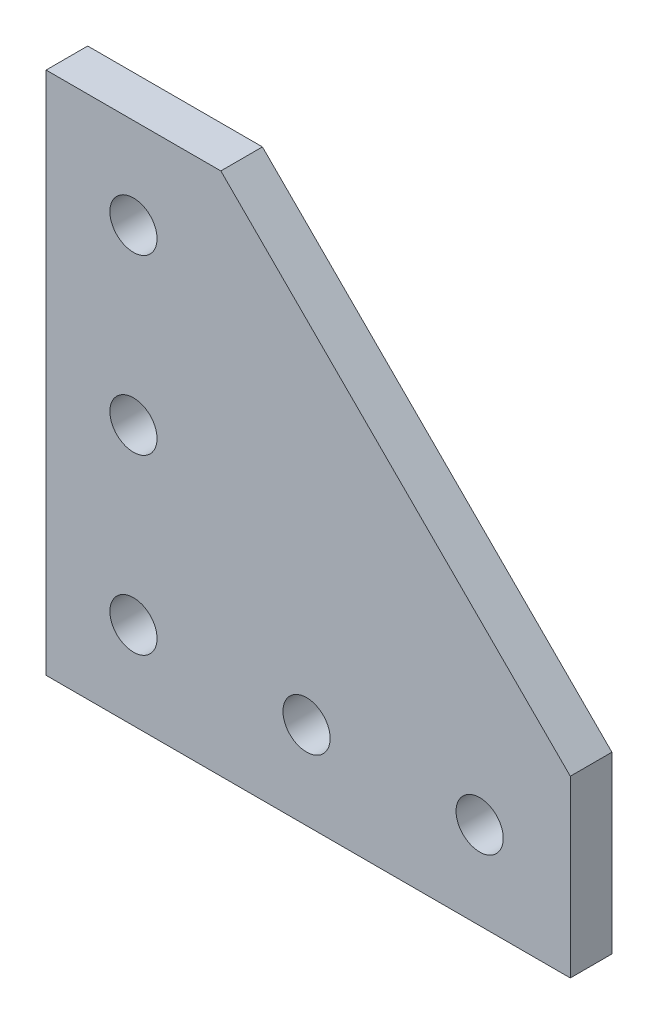
ISO-10303-21;
HEADER;
FILE_DESCRIPTION(('STEP AP214'),'2;1');
FILE_NAME('part.step','',(''),(''),'','','');
FILE_SCHEMA(('AUTOMOTIVE_DESIGN { 1 0 10303 214 1 1 1 1 }'));
ENDSEC;
DATA;
#1=APPLICATION_CONTEXT('core data for automotive mechanical design processes');
#2=APPLICATION_PROTOCOL_DEFINITION('international standard','automotive_design',2000,#1);
#3=PRODUCT_CONTEXT('',#1,'mechanical');
#4=PRODUCT('Part','Part','',(#3));
#5=PRODUCT_RELATED_PRODUCT_CATEGORY('part','',(#4));
#6=PRODUCT_DEFINITION_FORMATION('','',#4);
#7=PRODUCT_DEFINITION_CONTEXT('part definition',#1,'design');
#8=PRODUCT_DEFINITION('design','',#6,#7);
#9=PRODUCT_DEFINITION_SHAPE('','',#8);
#10=(LENGTH_UNIT() NAMED_UNIT(*) SI_UNIT(.MILLI.,.METRE.));
#11=(NAMED_UNIT(*) PLANE_ANGLE_UNIT() SI_UNIT($,.RADIAN.));
#12=(NAMED_UNIT(*) SI_UNIT($,.STERADIAN.) SOLID_ANGLE_UNIT());
#13=UNCERTAINTY_MEASURE_WITH_UNIT(LENGTH_MEASURE(1.E-05),#10,'distance_accuracy_value','');
#14=(GEOMETRIC_REPRESENTATION_CONTEXT(3) GLOBAL_UNCERTAINTY_ASSIGNED_CONTEXT((#13)) GLOBAL_UNIT_ASSIGNED_CONTEXT((#10,
#11,#12)) REPRESENTATION_CONTEXT('',''));
#15=CARTESIAN_POINT('',(0.,0.,0.));
#16=DIRECTION('',(0.,0.,1.));
#17=DIRECTION('',(1.,0.,0.));
#18=AXIS2_PLACEMENT_3D('',#15,#16,#17);
#19=CARTESIAN_POINT('',(0.,0.,2.38125));
#20=DIRECTION('',(0.,0.,-1.));
#21=DIRECTION('',(-1.,0.,0.));
#22=AXIS2_PLACEMENT_3D('',#19,#20,#21);
#23=PLANE('',#22);
#24=DIRECTION('',(1.,0.,0.));
#25=VECTOR('',#24,1.);
#26=CARTESIAN_POINT('',(60.,0.,2.38125));
#27=LINE('',#26,#25);
#28=CARTESIAN_POINT('',(0.,0.,2.38125));
#29=VERTEX_POINT('',#28);
#30=CARTESIAN_POINT('',(60.,0.,2.38125));
#31=VERTEX_POINT('',#30);
#32=EDGE_CURVE('E133',#29,#31,#27,.T.);
#33=ORIENTED_EDGE('',*,*,#32,.T.);
#34=DIRECTION('',(0.,1.,0.));
#35=VECTOR('',#34,1.);
#36=CARTESIAN_POINT('',(60.,20.,2.38125));
#37=LINE('',#36,#35);
#38=CARTESIAN_POINT('',(60.,20.,2.38125));
#39=VERTEX_POINT('',#38);
#40=EDGE_CURVE('E91',#31,#39,#37,.T.);
#41=ORIENTED_EDGE('',*,*,#40,.T.);
#42=DIRECTION('',(-0.707106781186548,0.707106781186548,0.));
#43=VECTOR('',#42,1.);
#44=CARTESIAN_POINT('',(60.,20.,2.38125));
#45=LINE('',#44,#43);
#46=CARTESIAN_POINT('',(20.,60.,2.38125));
#47=VERTEX_POINT('',#46);
#48=EDGE_CURVE('E95',#39,#47,#45,.T.);
#49=ORIENTED_EDGE('',*,*,#48,.T.);
#50=DIRECTION('',(-1.,0.,0.));
#51=VECTOR('',#50,1.);
#52=CARTESIAN_POINT('',(0.,60.,2.38125));
#53=LINE('',#52,#51);
#54=CARTESIAN_POINT('',(0.,60.,2.38125));
#55=VERTEX_POINT('',#54);
#56=EDGE_CURVE('E99',#47,#55,#53,.T.);
#57=ORIENTED_EDGE('',*,*,#56,.T.);
#58=DIRECTION('',(0.,-1.,0.));
#59=VECTOR('',#58,1.);
#60=CARTESIAN_POINT('',(0.,0.,2.38125));
#61=LINE('',#60,#59);
#62=EDGE_CURVE('E57',#55,#29,#61,.T.);
#63=ORIENTED_EDGE('',*,*,#62,.T.);
#64=EDGE_LOOP('',(#33,#41,#49,#57,#63));
#65=FACE_BOUND('',#64,.T.);
#66=CARTESIAN_POINT('',(10.,10.,2.38125));
#67=DIRECTION('',(0.,0.,1.));
#68=DIRECTION('',(1.,0.,0.));
#69=AXIS2_PLACEMENT_3D('',#66,#67,#68);
#70=CIRCLE('',#69,2.7);
#71=CARTESIAN_POINT('',(7.3,10.,2.38125));
#72=VERTEX_POINT('',#71);
#73=EDGE_CURVE('E124',#72,#72,#70,.T.);
#74=ORIENTED_EDGE('',*,*,#73,.F.);
#75=EDGE_LOOP('',(#74));
#76=FACE_BOUND('',#75,.T.);
#77=CARTESIAN_POINT('',(29.812,10.,2.38125));
#78=DIRECTION('',(0.,0.,1.));
#79=DIRECTION('',(1.,0.,0.));
#80=AXIS2_PLACEMENT_3D('',#77,#78,#79);
#81=CIRCLE('',#80,2.7);
#82=CARTESIAN_POINT('',(27.112,10.,2.38125));
#83=VERTEX_POINT('',#82);
#84=EDGE_CURVE('E211',#83,#83,#81,.T.);
#85=ORIENTED_EDGE('',*,*,#84,.F.);
#86=EDGE_LOOP('',(#85));
#87=FACE_BOUND('',#86,.T.);
#88=CARTESIAN_POINT('',(49.624,10.,2.38125));
#89=DIRECTION('',(0.,0.,1.));
#90=DIRECTION('',(1.,0.,0.));
#91=AXIS2_PLACEMENT_3D('',#88,#89,#90);
#92=CIRCLE('',#91,2.7);
#93=CARTESIAN_POINT('',(46.924,10.,2.38125));
#94=VERTEX_POINT('',#93);
#95=EDGE_CURVE('E203',#94,#94,#92,.T.);
#96=ORIENTED_EDGE('',*,*,#95,.F.);
#97=EDGE_LOOP('',(#96));
#98=FACE_BOUND('',#97,.T.);
#99=CARTESIAN_POINT('',(10.,49.624,2.38125));
#100=DIRECTION('',(0.,0.,1.));
#101=DIRECTION('',(1.,0.,0.));
#102=AXIS2_PLACEMENT_3D('',#99,#100,#101);
#103=CIRCLE('',#102,2.7);
#104=CARTESIAN_POINT('',(7.3,49.624,2.38125));
#105=VERTEX_POINT('',#104);
#106=EDGE_CURVE('E195',#105,#105,#103,.T.);
#107=ORIENTED_EDGE('',*,*,#106,.F.);
#108=EDGE_LOOP('',(#107));
#109=FACE_BOUND('',#108,.T.);
#110=CARTESIAN_POINT('',(10.,29.812,2.38125));
#111=DIRECTION('',(0.,0.,1.));
#112=DIRECTION('',(1.,0.,0.));
#113=AXIS2_PLACEMENT_3D('',#110,#111,#112);
#114=CIRCLE('',#113,2.7);
#115=CARTESIAN_POINT('',(7.3,29.812,2.38125));
#116=VERTEX_POINT('',#115);
#117=EDGE_CURVE('E184',#116,#116,#114,.T.);
#118=ORIENTED_EDGE('',*,*,#117,.F.);
#119=EDGE_LOOP('',(#118));
#120=FACE_BOUND('',#119,.T.);
#121=ADVANCED_FACE('F39',(#65,#76,#87,#98,#109,#120),#23,.F.);
#122=CARTESIAN_POINT('',(0.,0.,-2.38125));
#123=DIRECTION('',(0.,0.,-1.));
#124=DIRECTION('',(-1.,0.,0.));
#125=AXIS2_PLACEMENT_3D('',#122,#123,#124);
#126=PLANE('',#125);
#127=CARTESIAN_POINT('',(10.,49.624,-2.38125));
#128=DIRECTION('',(0.,0.,1.));
#129=DIRECTION('',(1.,0.,0.));
#130=AXIS2_PLACEMENT_3D('',#127,#128,#129);
#131=CIRCLE('',#130,2.7);
#132=CARTESIAN_POINT('',(7.3,49.624,-2.38125));
#133=VERTEX_POINT('',#132);
#134=EDGE_CURVE('E192',#133,#133,#131,.T.);
#135=ORIENTED_EDGE('',*,*,#134,.T.);
#136=EDGE_LOOP('',(#135));
#137=FACE_BOUND('',#136,.T.);
#138=CARTESIAN_POINT('',(29.812,10.,-2.38125));
#139=DIRECTION('',(0.,0.,1.));
#140=DIRECTION('',(1.,0.,0.));
#141=AXIS2_PLACEMENT_3D('',#138,#139,#140);
#142=CIRCLE('',#141,2.7);
#143=CARTESIAN_POINT('',(27.112,10.,-2.38125));
#144=VERTEX_POINT('',#143);
#145=EDGE_CURVE('E207',#144,#144,#142,.T.);
#146=ORIENTED_EDGE('',*,*,#145,.T.);
#147=EDGE_LOOP('',(#146));
#148=FACE_BOUND('',#147,.T.);
#149=DIRECTION('',(1.,0.,0.));
#150=VECTOR('',#149,1.);
#151=CARTESIAN_POINT('',(60.,0.,-2.38125));
#152=LINE('',#151,#150);
#153=CARTESIAN_POINT('',(0.,0.,-2.38125));
#154=VERTEX_POINT('',#153);
#155=CARTESIAN_POINT('',(60.,0.,-2.38125));
#156=VERTEX_POINT('',#155);
#157=EDGE_CURVE('E119',#154,#156,#152,.T.);
#158=ORIENTED_EDGE('',*,*,#157,.F.);
#159=DIRECTION('',(0.,-1.,0.));
#160=VECTOR('',#159,1.);
#161=CARTESIAN_POINT('',(0.,0.,-2.38125));
#162=LINE('',#161,#160);
#163=CARTESIAN_POINT('',(0.,60.,-2.38125));
#164=VERTEX_POINT('',#163);
#165=EDGE_CURVE('E83',#164,#154,#162,.T.);
#166=ORIENTED_EDGE('',*,*,#165,.F.);
#167=DIRECTION('',(-1.,0.,0.));
#168=VECTOR('',#167,1.);
#169=CARTESIAN_POINT('',(0.,60.,-2.38125));
#170=LINE('',#169,#168);
#171=CARTESIAN_POINT('',(20.,60.,-2.38125));
#172=VERTEX_POINT('',#171);
#173=EDGE_CURVE('E77',#172,#164,#170,.T.);
#174=ORIENTED_EDGE('',*,*,#173,.F.);
#175=DIRECTION('',(-0.707106781186548,0.707106781186548,0.));
#176=VECTOR('',#175,1.);
#177=CARTESIAN_POINT('',(60.,20.,-2.38125));
#178=LINE('',#177,#176);
#179=CARTESIAN_POINT('',(60.,20.,-2.38125));
#180=VERTEX_POINT('',#179);
#181=EDGE_CURVE('E107',#180,#172,#178,.T.);
#182=ORIENTED_EDGE('',*,*,#181,.F.);
#183=DIRECTION('',(0.,1.,0.));
#184=VECTOR('',#183,1.);
#185=CARTESIAN_POINT('',(60.,20.,-2.38125));
#186=LINE('',#185,#184);
#187=EDGE_CURVE('E123',#156,#180,#186,.T.);
#188=ORIENTED_EDGE('',*,*,#187,.F.);
#189=EDGE_LOOP('',(#158,#166,#174,#182,#188));
#190=FACE_BOUND('',#189,.T.);
#191=CARTESIAN_POINT('',(10.,10.,-2.38125));
#192=DIRECTION('',(0.,0.,1.));
#193=DIRECTION('',(1.,0.,0.));
#194=AXIS2_PLACEMENT_3D('',#191,#192,#193);
#195=CIRCLE('',#194,2.7);
#196=CARTESIAN_POINT('',(7.3,10.,-2.38125));
#197=VERTEX_POINT('',#196);
#198=EDGE_CURVE('E215',#197,#197,#195,.T.);
#199=ORIENTED_EDGE('',*,*,#198,.T.);
#200=EDGE_LOOP('',(#199));
#201=FACE_BOUND('',#200,.T.);
#202=CARTESIAN_POINT('',(49.624,10.,-2.38125));
#203=DIRECTION('',(0.,0.,1.));
#204=DIRECTION('',(1.,0.,0.));
#205=AXIS2_PLACEMENT_3D('',#202,#203,#204);
#206=CIRCLE('',#205,2.7);
#207=CARTESIAN_POINT('',(46.924,10.,-2.38125));
#208=VERTEX_POINT('',#207);
#209=EDGE_CURVE('E199',#208,#208,#206,.T.);
#210=ORIENTED_EDGE('',*,*,#209,.T.);
#211=EDGE_LOOP('',(#210));
#212=FACE_BOUND('',#211,.T.);
#213=CARTESIAN_POINT('',(10.,29.812,-2.38125));
#214=DIRECTION('',(0.,0.,1.));
#215=DIRECTION('',(1.,0.,0.));
#216=AXIS2_PLACEMENT_3D('',#213,#214,#215);
#217=CIRCLE('',#216,2.7);
#218=CARTESIAN_POINT('',(7.3,29.812,-2.38125));
#219=VERTEX_POINT('',#218);
#220=EDGE_CURVE('E187',#219,#219,#217,.T.);
#221=ORIENTED_EDGE('',*,*,#220,.T.);
#222=EDGE_LOOP('',(#221));
#223=FACE_BOUND('',#222,.T.);
#224=ADVANCED_FACE('F140',(#137,#148,#190,#201,#212,#223),#126,.T.);
#225=CARTESIAN_POINT('',(60.,0.,2.38125));
#226=DIRECTION('',(0.,1.,0.));
#227=DIRECTION('',(-1.,0.,0.));
#228=AXIS2_PLACEMENT_3D('',#225,#226,#227);
#229=PLANE('',#228);
#230=ORIENTED_EDGE('',*,*,#157,.T.);
#231=DIRECTION('',(0.,0.,-1.));
#232=VECTOR('',#231,1.);
#233=CARTESIAN_POINT('',(60.,0.,2.38125));
#234=LINE('',#233,#232);
#235=EDGE_CURVE('E11',#31,#156,#234,.T.);
#236=ORIENTED_EDGE('',*,*,#235,.F.);
#237=ORIENTED_EDGE('',*,*,#32,.F.);
#238=DIRECTION('',(0.,0.,-1.));
#239=VECTOR('',#238,1.);
#240=CARTESIAN_POINT('',(0.,0.,2.38125));
#241=LINE('',#240,#239);
#242=EDGE_CURVE('E115',#29,#154,#241,.T.);
#243=ORIENTED_EDGE('',*,*,#242,.T.);
#244=EDGE_LOOP('',(#230,#236,#237,#243));
#245=FACE_BOUND('',#244,.T.);
#246=ADVANCED_FACE('F41',(#245),#229,.F.);
#247=CARTESIAN_POINT('',(60.,20.,2.38125));
#248=DIRECTION('',(-1.,0.,0.));
#249=DIRECTION('',(0.,0.,1.));
#250=AXIS2_PLACEMENT_3D('',#247,#248,#249);
#251=PLANE('',#250);
#252=ORIENTED_EDGE('',*,*,#187,.T.);
#253=DIRECTION('',(0.,0.,-1.));
#254=VECTOR('',#253,1.);
#255=CARTESIAN_POINT('',(60.,20.,2.38125));
#256=LINE('',#255,#254);
#257=EDGE_CURVE('E49',#39,#180,#256,.T.);
#258=ORIENTED_EDGE('',*,*,#257,.F.);
#259=ORIENTED_EDGE('',*,*,#40,.F.);
#260=ORIENTED_EDGE('',*,*,#235,.T.);
#261=EDGE_LOOP('',(#252,#258,#259,#260));
#262=FACE_BOUND('',#261,.T.);
#263=ADVANCED_FACE('F280',(#262),#251,.F.);
#264=CARTESIAN_POINT('',(60.,20.,2.38125));
#265=DIRECTION('',(-0.707106781186548,-0.707106781186548,0.));
#266=DIRECTION('',(0.707106781186548,-0.707106781186548,0.));
#267=AXIS2_PLACEMENT_3D('',#264,#265,#266);
#268=PLANE('',#267);
#269=ORIENTED_EDGE('',*,*,#181,.T.);
#270=DIRECTION('',(0.,0.,-1.));
#271=VECTOR('',#270,1.);
#272=CARTESIAN_POINT('',(20.,60.,2.38125));
#273=LINE('',#272,#271);
#274=EDGE_CURVE('E104',#47,#172,#273,.T.);
#275=ORIENTED_EDGE('',*,*,#274,.F.);
#276=ORIENTED_EDGE('',*,*,#48,.F.);
#277=ORIENTED_EDGE('',*,*,#257,.T.);
#278=EDGE_LOOP('',(#269,#275,#276,#277));
#279=FACE_BOUND('',#278,.T.);
#280=ADVANCED_FACE('F105',(#279),#268,.F.);
#281=CARTESIAN_POINT('',(0.,60.,2.38125));
#282=DIRECTION('',(0.,-1.,0.));
#283=DIRECTION('',(0.,0.,-1.));
#284=AXIS2_PLACEMENT_3D('',#281,#282,#283);
#285=PLANE('',#284);
#286=ORIENTED_EDGE('',*,*,#173,.T.);
#287=DIRECTION('',(0.,0.,-1.));
#288=VECTOR('',#287,1.);
#289=CARTESIAN_POINT('',(0.,60.,2.38125));
#290=LINE('',#289,#288);
#291=EDGE_CURVE('E109',#55,#164,#290,.T.);
#292=ORIENTED_EDGE('',*,*,#291,.F.);
#293=ORIENTED_EDGE('',*,*,#56,.F.);
#294=ORIENTED_EDGE('',*,*,#274,.T.);
#295=EDGE_LOOP('',(#286,#292,#293,#294));
#296=FACE_BOUND('',#295,.T.);
#297=ADVANCED_FACE('F111',(#296),#285,.F.);
#298=CARTESIAN_POINT('',(0.,0.,2.38125));
#299=DIRECTION('',(1.,0.,0.));
#300=DIRECTION('',(0.,0.,-1.));
#301=AXIS2_PLACEMENT_3D('',#298,#299,#300);
#302=PLANE('',#301);
#303=ORIENTED_EDGE('',*,*,#165,.T.);
#304=ORIENTED_EDGE('',*,*,#242,.F.);
#305=ORIENTED_EDGE('',*,*,#62,.F.);
#306=ORIENTED_EDGE('',*,*,#291,.T.);
#307=EDGE_LOOP('',(#303,#304,#305,#306));
#308=FACE_BOUND('',#307,.T.);
#309=ADVANCED_FACE('F145',(#308),#302,.F.);
#310=CARTESIAN_POINT('',(10.,10.,2.38125));
#311=DIRECTION('',(0.,0.,-1.));
#312=DIRECTION('',(-1.,0.,0.));
#313=AXIS2_PLACEMENT_3D('',#310,#311,#312);
#314=CYLINDRICAL_SURFACE('',#313,2.7);
#315=CARTESIAN_POINT('',(7.3,10.,2.38125));
#316=CARTESIAN_POINT('',(7.3,10.,2.331640625));
#317=CARTESIAN_POINT('',(7.3,10.,2.28203125));
#318=CARTESIAN_POINT('',(7.3,10.,2.1828125));
#319=CARTESIAN_POINT('',(7.3,10.,2.133203125));
#320=CARTESIAN_POINT('',(7.3,10.,2.033984375));
#321=CARTESIAN_POINT('',(7.3,10.,1.984375));
#322=CARTESIAN_POINT('',(7.3,10.,1.88515625));
#323=CARTESIAN_POINT('',(7.3,10.,1.835546875));
#324=CARTESIAN_POINT('',(7.3,10.,1.736328125));
#325=CARTESIAN_POINT('',(7.3,10.,1.68671875));
#326=CARTESIAN_POINT('',(7.3,10.,1.5875));
#327=CARTESIAN_POINT('',(7.3,10.,1.537890625));
#328=CARTESIAN_POINT('',(7.3,10.,1.438671875));
#329=CARTESIAN_POINT('',(7.3,10.,1.3890625));
#330=CARTESIAN_POINT('',(7.3,10.,1.28984375));
#331=CARTESIAN_POINT('',(7.3,10.,1.240234375));
#332=CARTESIAN_POINT('',(7.3,10.,1.141015625));
#333=CARTESIAN_POINT('',(7.3,10.,1.09140625));
#334=CARTESIAN_POINT('',(7.3,10.,0.9921875));
#335=CARTESIAN_POINT('',(7.3,10.,0.942578125));
#336=CARTESIAN_POINT('',(7.3,10.,0.843359375));
#337=CARTESIAN_POINT('',(7.3,10.,0.79375));
#338=CARTESIAN_POINT('',(7.3,10.,0.69453125));
#339=CARTESIAN_POINT('',(7.3,10.,0.644921875));
#340=CARTESIAN_POINT('',(7.3,10.,0.545703125));
#341=CARTESIAN_POINT('',(7.3,10.,0.49609375));
#342=CARTESIAN_POINT('',(7.3,10.,0.396875));
#343=CARTESIAN_POINT('',(7.3,10.,0.347265625));
#344=CARTESIAN_POINT('',(7.3,10.,0.248046875));
#345=CARTESIAN_POINT('',(7.3,10.,0.1984375));
#346=CARTESIAN_POINT('',(7.3,10.,0.09921875));
#347=CARTESIAN_POINT('',(7.3,10.,0.049609375));
#348=CARTESIAN_POINT('',(7.3,10.,-0.049609375));
#349=CARTESIAN_POINT('',(7.3,10.,-0.09921875));
#350=CARTESIAN_POINT('',(7.3,10.,-0.1984375));
#351=CARTESIAN_POINT('',(7.3,10.,-0.248046875));
#352=CARTESIAN_POINT('',(7.3,10.,-0.347265625));
#353=CARTESIAN_POINT('',(7.3,10.,-0.396875));
#354=CARTESIAN_POINT('',(7.3,10.,-0.49609375));
#355=CARTESIAN_POINT('',(7.3,10.,-0.545703125));
#356=CARTESIAN_POINT('',(7.3,10.,-0.644921875));
#357=CARTESIAN_POINT('',(7.3,10.,-0.69453125));
#358=CARTESIAN_POINT('',(7.3,10.,-0.79375));
#359=CARTESIAN_POINT('',(7.3,10.,-0.843359375));
#360=CARTESIAN_POINT('',(7.3,10.,-0.942578125));
#361=CARTESIAN_POINT('',(7.3,10.,-0.9921875));
#362=CARTESIAN_POINT('',(7.3,10.,-1.09140625));
#363=CARTESIAN_POINT('',(7.3,10.,-1.141015625));
#364=CARTESIAN_POINT('',(7.3,10.,-1.240234375));
#365=CARTESIAN_POINT('',(7.3,10.,-1.28984375));
#366=CARTESIAN_POINT('',(7.3,10.,-1.3890625));
#367=CARTESIAN_POINT('',(7.3,10.,-1.438671875));
#368=CARTESIAN_POINT('',(7.3,10.,-1.537890625));
#369=CARTESIAN_POINT('',(7.3,10.,-1.5875));
#370=CARTESIAN_POINT('',(7.3,10.,-1.68671875));
#371=CARTESIAN_POINT('',(7.3,10.,-1.736328125));
#372=CARTESIAN_POINT('',(7.3,10.,-1.835546875));
#373=CARTESIAN_POINT('',(7.3,10.,-1.88515625));
#374=CARTESIAN_POINT('',(7.3,10.,-1.984375));
#375=CARTESIAN_POINT('',(7.3,10.,-2.033984375));
#376=CARTESIAN_POINT('',(7.3,10.,-2.133203125));
#377=CARTESIAN_POINT('',(7.3,10.,-2.1828125));
#378=CARTESIAN_POINT('',(7.3,10.,-2.28203125));
#379=CARTESIAN_POINT('',(7.3,10.,-2.331640625));
#380=CARTESIAN_POINT('',(7.3,10.,-2.38125));
#381=B_SPLINE_CURVE_WITH_KNOTS('',3,(#315,#316,#317,#318,#319,#320,#321,#322,#323,#324,#325,
#326,#327,#328,#329,#330,#331,#332,#333,#334,#335,#336,#337,#338,#339,#340,#341,#342,#343,#344,
#345,#346,#347,#348,#349,#350,#351,#352,#353,#354,#355,#356,#357,#358,#359,#360,#361,#362,#363,
#364,#365,#366,#367,#368,#369,#370,#371,#372,#373,#374,#375,#376,#377,#378,#379,#380),
.UNSPECIFIED.,.F.,.F.,(4,2,2,2,2,2,2,2,2,2,2,2,2,2,2,2,2,2,2,2,2,2,2,2,2,2,2,2,2,2,2,2,4),(0.,
0.148828125,0.29765625,0.446484375,0.5953125,0.744140625,0.89296875,1.041796875,1.190625,
1.339453125,1.48828125,1.637109375,1.7859375,1.934765625,2.08359375,2.232421875,2.38125,
2.530078125,2.67890625,2.827734375,2.9765625,3.125390625,3.27421875,3.423046875,3.571875,
3.720703125,3.86953125,4.018359375,4.1671875,4.316015625,4.46484375,4.613671875,4.7625),.UNSPECIFIED.);
#382=EDGE_CURVE('BSEAM147',#72,#197,#381,.T.);
#383=ORIENTED_EDGE('',*,*,#73,.T.);
#384=ORIENTED_EDGE('',*,*,#198,.F.);
#385=ORIENTED_EDGE('',*,*,#382,.T.);
#386=ORIENTED_EDGE('',*,*,#382,.F.);
#387=EDGE_LOOP('',(#383,#385,#384,#386));
#388=FACE_BOUND('',#387,.T.);
#389=ADVANCED_FACE('F147',(#388),#314,.F.);
#390=CARTESIAN_POINT('',(29.812,10.,2.38125));
#391=DIRECTION('',(0.,0.,-1.));
#392=DIRECTION('',(-1.,0.,0.));
#393=AXIS2_PLACEMENT_3D('',#390,#391,#392);
#394=CYLINDRICAL_SURFACE('',#393,2.7);
#395=CARTESIAN_POINT('',(27.112,10.,2.38125));
#396=CARTESIAN_POINT('',(27.112,10.,2.331640625));
#397=CARTESIAN_POINT('',(27.112,10.,2.28203125));
#398=CARTESIAN_POINT('',(27.112,10.,2.1828125));
#399=CARTESIAN_POINT('',(27.112,10.,2.133203125));
#400=CARTESIAN_POINT('',(27.112,10.,2.033984375));
#401=CARTESIAN_POINT('',(27.112,10.,1.984375));
#402=CARTESIAN_POINT('',(27.112,10.,1.88515625));
#403=CARTESIAN_POINT('',(27.112,10.,1.835546875));
#404=CARTESIAN_POINT('',(27.112,10.,1.736328125));
#405=CARTESIAN_POINT('',(27.112,10.,1.68671875));
#406=CARTESIAN_POINT('',(27.112,10.,1.5875));
#407=CARTESIAN_POINT('',(27.112,10.,1.537890625));
#408=CARTESIAN_POINT('',(27.112,10.,1.438671875));
#409=CARTESIAN_POINT('',(27.112,10.,1.3890625));
#410=CARTESIAN_POINT('',(27.112,10.,1.28984375));
#411=CARTESIAN_POINT('',(27.112,10.,1.240234375));
#412=CARTESIAN_POINT('',(27.112,10.,1.141015625));
#413=CARTESIAN_POINT('',(27.112,10.,1.09140625));
#414=CARTESIAN_POINT('',(27.112,10.,0.9921875));
#415=CARTESIAN_POINT('',(27.112,10.,0.942578125));
#416=CARTESIAN_POINT('',(27.112,10.,0.843359375));
#417=CARTESIAN_POINT('',(27.112,10.,0.79375));
#418=CARTESIAN_POINT('',(27.112,10.,0.69453125));
#419=CARTESIAN_POINT('',(27.112,10.,0.644921875));
#420=CARTESIAN_POINT('',(27.112,10.,0.545703125));
#421=CARTESIAN_POINT('',(27.112,10.,0.49609375));
#422=CARTESIAN_POINT('',(27.112,10.,0.396875));
#423=CARTESIAN_POINT('',(27.112,10.,0.347265625));
#424=CARTESIAN_POINT('',(27.112,10.,0.248046875));
#425=CARTESIAN_POINT('',(27.112,10.,0.1984375));
#426=CARTESIAN_POINT('',(27.112,10.,0.09921875));
#427=CARTESIAN_POINT('',(27.112,10.,0.049609375));
#428=CARTESIAN_POINT('',(27.112,10.,-0.049609375));
#429=CARTESIAN_POINT('',(27.112,10.,-0.09921875));
#430=CARTESIAN_POINT('',(27.112,10.,-0.1984375));
#431=CARTESIAN_POINT('',(27.112,10.,-0.248046875));
#432=CARTESIAN_POINT('',(27.112,10.,-0.347265625));
#433=CARTESIAN_POINT('',(27.112,10.,-0.396875));
#434=CARTESIAN_POINT('',(27.112,10.,-0.49609375));
#435=CARTESIAN_POINT('',(27.112,10.,-0.545703125));
#436=CARTESIAN_POINT('',(27.112,10.,-0.644921875));
#437=CARTESIAN_POINT('',(27.112,10.,-0.69453125));
#438=CARTESIAN_POINT('',(27.112,10.,-0.79375));
#439=CARTESIAN_POINT('',(27.112,10.,-0.843359375));
#440=CARTESIAN_POINT('',(27.112,10.,-0.942578125));
#441=CARTESIAN_POINT('',(27.112,10.,-0.9921875));
#442=CARTESIAN_POINT('',(27.112,10.,-1.09140625));
#443=CARTESIAN_POINT('',(27.112,10.,-1.141015625));
#444=CARTESIAN_POINT('',(27.112,10.,-1.240234375));
#445=CARTESIAN_POINT('',(27.112,10.,-1.28984375));
#446=CARTESIAN_POINT('',(27.112,10.,-1.3890625));
#447=CARTESIAN_POINT('',(27.112,10.,-1.438671875));
#448=CARTESIAN_POINT('',(27.112,10.,-1.537890625));
#449=CARTESIAN_POINT('',(27.112,10.,-1.5875));
#450=CARTESIAN_POINT('',(27.112,10.,-1.68671875));
#451=CARTESIAN_POINT('',(27.112,10.,-1.736328125));
#452=CARTESIAN_POINT('',(27.112,10.,-1.835546875));
#453=CARTESIAN_POINT('',(27.112,10.,-1.88515625));
#454=CARTESIAN_POINT('',(27.112,10.,-1.984375));
#455=CARTESIAN_POINT('',(27.112,10.,-2.033984375));
#456=CARTESIAN_POINT('',(27.112,10.,-2.133203125));
#457=CARTESIAN_POINT('',(27.112,10.,-2.1828125));
#458=CARTESIAN_POINT('',(27.112,10.,-2.28203125));
#459=CARTESIAN_POINT('',(27.112,10.,-2.331640625));
#460=CARTESIAN_POINT('',(27.112,10.,-2.38125));
#461=B_SPLINE_CURVE_WITH_KNOTS('',3,(#395,#396,#397,#398,#399,#400,#401,#402,#403,#404,#405,
#406,#407,#408,#409,#410,#411,#412,#413,#414,#415,#416,#417,#418,#419,#420,#421,#422,#423,#424,
#425,#426,#427,#428,#429,#430,#431,#432,#433,#434,#435,#436,#437,#438,#439,#440,#441,#442,#443,
#444,#445,#446,#447,#448,#449,#450,#451,#452,#453,#454,#455,#456,#457,#458,#459,#460),
.UNSPECIFIED.,.F.,.F.,(4,2,2,2,2,2,2,2,2,2,2,2,2,2,2,2,2,2,2,2,2,2,2,2,2,2,2,2,2,2,2,2,4),(0.,
0.148828125,0.29765625,0.446484375,0.5953125,0.744140625,0.89296875,1.041796875,1.190625,
1.339453125,1.48828125,1.637109375,1.7859375,1.934765625,2.08359375,2.232421875,2.38125,
2.530078125,2.67890625,2.827734375,2.9765625,3.125390625,3.27421875,3.423046875,3.571875,
3.720703125,3.86953125,4.018359375,4.1671875,4.316015625,4.46484375,4.613671875,4.7625),.UNSPECIFIED.);
#462=EDGE_CURVE('BSEAM153',#83,#144,#461,.T.);
#463=ORIENTED_EDGE('',*,*,#84,.T.);
#464=ORIENTED_EDGE('',*,*,#145,.F.);
#465=ORIENTED_EDGE('',*,*,#462,.T.);
#466=ORIENTED_EDGE('',*,*,#462,.F.);
#467=EDGE_LOOP('',(#463,#465,#464,#466));
#468=FACE_BOUND('',#467,.T.);
#469=ADVANCED_FACE('F153',(#468),#394,.F.);
#470=CARTESIAN_POINT('',(49.624,10.,2.38125));
#471=DIRECTION('',(0.,0.,-1.));
#472=DIRECTION('',(-1.,0.,0.));
#473=AXIS2_PLACEMENT_3D('',#470,#471,#472);
#474=CYLINDRICAL_SURFACE('',#473,2.7);
#475=CARTESIAN_POINT('',(46.924,10.,2.38125));
#476=CARTESIAN_POINT('',(46.924,10.,2.331640625));
#477=CARTESIAN_POINT('',(46.924,10.,2.28203125));
#478=CARTESIAN_POINT('',(46.924,10.,2.1828125));
#479=CARTESIAN_POINT('',(46.924,10.,2.133203125));
#480=CARTESIAN_POINT('',(46.924,10.,2.033984375));
#481=CARTESIAN_POINT('',(46.924,10.,1.984375));
#482=CARTESIAN_POINT('',(46.924,10.,1.88515625));
#483=CARTESIAN_POINT('',(46.924,10.,1.835546875));
#484=CARTESIAN_POINT('',(46.924,10.,1.736328125));
#485=CARTESIAN_POINT('',(46.924,10.,1.68671875));
#486=CARTESIAN_POINT('',(46.924,10.,1.5875));
#487=CARTESIAN_POINT('',(46.924,10.,1.537890625));
#488=CARTESIAN_POINT('',(46.924,10.,1.438671875));
#489=CARTESIAN_POINT('',(46.924,10.,1.3890625));
#490=CARTESIAN_POINT('',(46.924,10.,1.28984375));
#491=CARTESIAN_POINT('',(46.924,10.,1.240234375));
#492=CARTESIAN_POINT('',(46.924,10.,1.141015625));
#493=CARTESIAN_POINT('',(46.924,10.,1.09140625));
#494=CARTESIAN_POINT('',(46.924,10.,0.9921875));
#495=CARTESIAN_POINT('',(46.924,10.,0.942578125));
#496=CARTESIAN_POINT('',(46.924,10.,0.843359375));
#497=CARTESIAN_POINT('',(46.924,10.,0.79375));
#498=CARTESIAN_POINT('',(46.924,10.,0.69453125));
#499=CARTESIAN_POINT('',(46.924,10.,0.644921875));
#500=CARTESIAN_POINT('',(46.924,10.,0.545703125));
#501=CARTESIAN_POINT('',(46.924,10.,0.49609375));
#502=CARTESIAN_POINT('',(46.924,10.,0.396875));
#503=CARTESIAN_POINT('',(46.924,10.,0.347265625));
#504=CARTESIAN_POINT('',(46.924,10.,0.248046875));
#505=CARTESIAN_POINT('',(46.924,10.,0.1984375));
#506=CARTESIAN_POINT('',(46.924,10.,0.09921875));
#507=CARTESIAN_POINT('',(46.924,10.,0.049609375));
#508=CARTESIAN_POINT('',(46.924,10.,-0.049609375));
#509=CARTESIAN_POINT('',(46.924,10.,-0.09921875));
#510=CARTESIAN_POINT('',(46.924,10.,-0.1984375));
#511=CARTESIAN_POINT('',(46.924,10.,-0.248046875));
#512=CARTESIAN_POINT('',(46.924,10.,-0.347265625));
#513=CARTESIAN_POINT('',(46.924,10.,-0.396875));
#514=CARTESIAN_POINT('',(46.924,10.,-0.49609375));
#515=CARTESIAN_POINT('',(46.924,10.,-0.545703125));
#516=CARTESIAN_POINT('',(46.924,10.,-0.644921875));
#517=CARTESIAN_POINT('',(46.924,10.,-0.69453125));
#518=CARTESIAN_POINT('',(46.924,10.,-0.79375));
#519=CARTESIAN_POINT('',(46.924,10.,-0.843359375));
#520=CARTESIAN_POINT('',(46.924,10.,-0.942578125));
#521=CARTESIAN_POINT('',(46.924,10.,-0.9921875));
#522=CARTESIAN_POINT('',(46.924,10.,-1.09140625));
#523=CARTESIAN_POINT('',(46.924,10.,-1.141015625));
#524=CARTESIAN_POINT('',(46.924,10.,-1.240234375));
#525=CARTESIAN_POINT('',(46.924,10.,-1.28984375));
#526=CARTESIAN_POINT('',(46.924,10.,-1.3890625));
#527=CARTESIAN_POINT('',(46.924,10.,-1.438671875));
#528=CARTESIAN_POINT('',(46.924,10.,-1.537890625));
#529=CARTESIAN_POINT('',(46.924,10.,-1.5875));
#530=CARTESIAN_POINT('',(46.924,10.,-1.68671875));
#531=CARTESIAN_POINT('',(46.924,10.,-1.736328125));
#532=CARTESIAN_POINT('',(46.924,10.,-1.835546875));
#533=CARTESIAN_POINT('',(46.924,10.,-1.88515625));
#534=CARTESIAN_POINT('',(46.924,10.,-1.984375));
#535=CARTESIAN_POINT('',(46.924,10.,-2.033984375));
#536=CARTESIAN_POINT('',(46.924,10.,-2.133203125));
#537=CARTESIAN_POINT('',(46.924,10.,-2.1828125));
#538=CARTESIAN_POINT('',(46.924,10.,-2.28203125));
#539=CARTESIAN_POINT('',(46.924,10.,-2.331640625));
#540=CARTESIAN_POINT('',(46.924,10.,-2.38125));
#541=B_SPLINE_CURVE_WITH_KNOTS('',3,(#475,#476,#477,#478,#479,#480,#481,#482,#483,#484,#485,
#486,#487,#488,#489,#490,#491,#492,#493,#494,#495,#496,#497,#498,#499,#500,#501,#502,#503,#504,
#505,#506,#507,#508,#509,#510,#511,#512,#513,#514,#515,#516,#517,#518,#519,#520,#521,#522,#523,
#524,#525,#526,#527,#528,#529,#530,#531,#532,#533,#534,#535,#536,#537,#538,#539,#540),
.UNSPECIFIED.,.F.,.F.,(4,2,2,2,2,2,2,2,2,2,2,2,2,2,2,2,2,2,2,2,2,2,2,2,2,2,2,2,2,2,2,2,4),(0.,
0.148828125,0.29765625,0.446484375,0.5953125,0.744140625,0.89296875,1.041796875,1.190625,
1.339453125,1.48828125,1.637109375,1.7859375,1.934765625,2.08359375,2.232421875,2.38125,
2.530078125,2.67890625,2.827734375,2.9765625,3.125390625,3.27421875,3.423046875,3.571875,
3.720703125,3.86953125,4.018359375,4.1671875,4.316015625,4.46484375,4.613671875,4.7625),.UNSPECIFIED.);
#542=EDGE_CURVE('BSEAM167',#94,#208,#541,.T.);
#543=ORIENTED_EDGE('',*,*,#95,.T.);
#544=ORIENTED_EDGE('',*,*,#209,.F.);
#545=ORIENTED_EDGE('',*,*,#542,.T.);
#546=ORIENTED_EDGE('',*,*,#542,.F.);
#547=EDGE_LOOP('',(#543,#545,#544,#546));
#548=FACE_BOUND('',#547,.T.);
#549=ADVANCED_FACE('F167',(#548),#474,.F.);
#550=CARTESIAN_POINT('',(10.,49.624,2.38125));
#551=DIRECTION('',(0.,0.,-1.));
#552=DIRECTION('',(-1.,0.,0.));
#553=AXIS2_PLACEMENT_3D('',#550,#551,#552);
#554=CYLINDRICAL_SURFACE('',#553,2.7);
#555=CARTESIAN_POINT('',(7.3,49.624,2.38125));
#556=CARTESIAN_POINT('',(7.3,49.624,2.331640625));
#557=CARTESIAN_POINT('',(7.3,49.624,2.28203125));
#558=CARTESIAN_POINT('',(7.3,49.624,2.1828125));
#559=CARTESIAN_POINT('',(7.3,49.624,2.133203125));
#560=CARTESIAN_POINT('',(7.3,49.624,2.033984375));
#561=CARTESIAN_POINT('',(7.3,49.624,1.984375));
#562=CARTESIAN_POINT('',(7.3,49.624,1.88515625));
#563=CARTESIAN_POINT('',(7.3,49.624,1.835546875));
#564=CARTESIAN_POINT('',(7.3,49.624,1.736328125));
#565=CARTESIAN_POINT('',(7.3,49.624,1.68671875));
#566=CARTESIAN_POINT('',(7.3,49.624,1.5875));
#567=CARTESIAN_POINT('',(7.3,49.624,1.537890625));
#568=CARTESIAN_POINT('',(7.3,49.624,1.438671875));
#569=CARTESIAN_POINT('',(7.3,49.624,1.3890625));
#570=CARTESIAN_POINT('',(7.3,49.624,1.28984375));
#571=CARTESIAN_POINT('',(7.3,49.624,1.240234375));
#572=CARTESIAN_POINT('',(7.3,49.624,1.141015625));
#573=CARTESIAN_POINT('',(7.3,49.624,1.09140625));
#574=CARTESIAN_POINT('',(7.3,49.624,0.9921875));
#575=CARTESIAN_POINT('',(7.3,49.624,0.942578125));
#576=CARTESIAN_POINT('',(7.3,49.624,0.843359375));
#577=CARTESIAN_POINT('',(7.3,49.624,0.79375));
#578=CARTESIAN_POINT('',(7.3,49.624,0.69453125));
#579=CARTESIAN_POINT('',(7.3,49.624,0.644921875));
#580=CARTESIAN_POINT('',(7.3,49.624,0.545703125));
#581=CARTESIAN_POINT('',(7.3,49.624,0.49609375));
#582=CARTESIAN_POINT('',(7.3,49.624,0.396875));
#583=CARTESIAN_POINT('',(7.3,49.624,0.347265625));
#584=CARTESIAN_POINT('',(7.3,49.624,0.248046875));
#585=CARTESIAN_POINT('',(7.3,49.624,0.1984375));
#586=CARTESIAN_POINT('',(7.3,49.624,0.09921875));
#587=CARTESIAN_POINT('',(7.3,49.624,0.049609375));
#588=CARTESIAN_POINT('',(7.3,49.624,-0.049609375));
#589=CARTESIAN_POINT('',(7.3,49.624,-0.09921875));
#590=CARTESIAN_POINT('',(7.3,49.624,-0.1984375));
#591=CARTESIAN_POINT('',(7.3,49.624,-0.248046875));
#592=CARTESIAN_POINT('',(7.3,49.624,-0.347265625));
#593=CARTESIAN_POINT('',(7.3,49.624,-0.396875));
#594=CARTESIAN_POINT('',(7.3,49.624,-0.49609375));
#595=CARTESIAN_POINT('',(7.3,49.624,-0.545703125));
#596=CARTESIAN_POINT('',(7.3,49.624,-0.644921875));
#597=CARTESIAN_POINT('',(7.3,49.624,-0.69453125));
#598=CARTESIAN_POINT('',(7.3,49.624,-0.79375));
#599=CARTESIAN_POINT('',(7.3,49.624,-0.843359375));
#600=CARTESIAN_POINT('',(7.3,49.624,-0.942578125));
#601=CARTESIAN_POINT('',(7.3,49.624,-0.9921875));
#602=CARTESIAN_POINT('',(7.3,49.624,-1.09140625));
#603=CARTESIAN_POINT('',(7.3,49.624,-1.141015625));
#604=CARTESIAN_POINT('',(7.3,49.624,-1.240234375));
#605=CARTESIAN_POINT('',(7.3,49.624,-1.28984375));
#606=CARTESIAN_POINT('',(7.3,49.624,-1.3890625));
#607=CARTESIAN_POINT('',(7.3,49.624,-1.438671875));
#608=CARTESIAN_POINT('',(7.3,49.624,-1.537890625));
#609=CARTESIAN_POINT('',(7.3,49.624,-1.5875));
#610=CARTESIAN_POINT('',(7.3,49.624,-1.68671875));
#611=CARTESIAN_POINT('',(7.3,49.624,-1.736328125));
#612=CARTESIAN_POINT('',(7.3,49.624,-1.835546875));
#613=CARTESIAN_POINT('',(7.3,49.624,-1.88515625));
#614=CARTESIAN_POINT('',(7.3,49.624,-1.984375));
#615=CARTESIAN_POINT('',(7.3,49.624,-2.033984375));
#616=CARTESIAN_POINT('',(7.3,49.624,-2.133203125));
#617=CARTESIAN_POINT('',(7.3,49.624,-2.1828125));
#618=CARTESIAN_POINT('',(7.3,49.624,-2.28203125));
#619=CARTESIAN_POINT('',(7.3,49.624,-2.331640625));
#620=CARTESIAN_POINT('',(7.3,49.624,-2.38125));
#621=B_SPLINE_CURVE_WITH_KNOTS('',3,(#555,#556,#557,#558,#559,#560,#561,#562,#563,#564,#565,
#566,#567,#568,#569,#570,#571,#572,#573,#574,#575,#576,#577,#578,#579,#580,#581,#582,#583,#584,
#585,#586,#587,#588,#589,#590,#591,#592,#593,#594,#595,#596,#597,#598,#599,#600,#601,#602,#603,
#604,#605,#606,#607,#608,#609,#610,#611,#612,#613,#614,#615,#616,#617,#618,#619,#620),
.UNSPECIFIED.,.F.,.F.,(4,2,2,2,2,2,2,2,2,2,2,2,2,2,2,2,2,2,2,2,2,2,2,2,2,2,2,2,2,2,2,2,4),(0.,
0.148828125,0.29765625,0.446484375,0.5953125,0.744140625,0.89296875,1.041796875,1.190625,
1.339453125,1.48828125,1.637109375,1.7859375,1.934765625,2.08359375,2.232421875,2.38125,
2.530078125,2.67890625,2.827734375,2.9765625,3.125390625,3.27421875,3.423046875,3.571875,
3.720703125,3.86953125,4.018359375,4.1671875,4.316015625,4.46484375,4.613671875,4.7625),.UNSPECIFIED.);
#622=EDGE_CURVE('BSEAM171',#105,#133,#621,.T.);
#623=ORIENTED_EDGE('',*,*,#106,.T.);
#624=ORIENTED_EDGE('',*,*,#134,.F.);
#625=ORIENTED_EDGE('',*,*,#622,.T.);
#626=ORIENTED_EDGE('',*,*,#622,.F.);
#627=EDGE_LOOP('',(#623,#625,#624,#626));
#628=FACE_BOUND('',#627,.T.);
#629=ADVANCED_FACE('F171',(#628),#554,.F.);
#630=CARTESIAN_POINT('',(10.,29.812,2.38125));
#631=DIRECTION('',(0.,0.,-1.));
#632=DIRECTION('',(-1.,0.,0.));
#633=AXIS2_PLACEMENT_3D('',#630,#631,#632);
#634=CYLINDRICAL_SURFACE('',#633,2.7);
#635=CARTESIAN_POINT('',(7.3,29.812,2.38125));
#636=CARTESIAN_POINT('',(7.3,29.812,2.331640625));
#637=CARTESIAN_POINT('',(7.3,29.812,2.28203125));
#638=CARTESIAN_POINT('',(7.3,29.812,2.1828125));
#639=CARTESIAN_POINT('',(7.3,29.812,2.133203125));
#640=CARTESIAN_POINT('',(7.3,29.812,2.033984375));
#641=CARTESIAN_POINT('',(7.3,29.812,1.984375));
#642=CARTESIAN_POINT('',(7.3,29.812,1.88515625));
#643=CARTESIAN_POINT('',(7.3,29.812,1.835546875));
#644=CARTESIAN_POINT('',(7.3,29.812,1.736328125));
#645=CARTESIAN_POINT('',(7.3,29.812,1.68671875));
#646=CARTESIAN_POINT('',(7.3,29.812,1.5875));
#647=CARTESIAN_POINT('',(7.3,29.812,1.537890625));
#648=CARTESIAN_POINT('',(7.3,29.812,1.438671875));
#649=CARTESIAN_POINT('',(7.3,29.812,1.3890625));
#650=CARTESIAN_POINT('',(7.3,29.812,1.28984375));
#651=CARTESIAN_POINT('',(7.3,29.812,1.240234375));
#652=CARTESIAN_POINT('',(7.3,29.812,1.141015625));
#653=CARTESIAN_POINT('',(7.3,29.812,1.09140625));
#654=CARTESIAN_POINT('',(7.3,29.812,0.9921875));
#655=CARTESIAN_POINT('',(7.3,29.812,0.942578125));
#656=CARTESIAN_POINT('',(7.3,29.812,0.843359375));
#657=CARTESIAN_POINT('',(7.3,29.812,0.79375));
#658=CARTESIAN_POINT('',(7.3,29.812,0.69453125));
#659=CARTESIAN_POINT('',(7.3,29.812,0.644921875));
#660=CARTESIAN_POINT('',(7.3,29.812,0.545703125));
#661=CARTESIAN_POINT('',(7.3,29.812,0.49609375));
#662=CARTESIAN_POINT('',(7.3,29.812,0.396875));
#663=CARTESIAN_POINT('',(7.3,29.812,0.347265625));
#664=CARTESIAN_POINT('',(7.3,29.812,0.248046875));
#665=CARTESIAN_POINT('',(7.3,29.812,0.1984375));
#666=CARTESIAN_POINT('',(7.3,29.812,0.09921875));
#667=CARTESIAN_POINT('',(7.3,29.812,0.049609375));
#668=CARTESIAN_POINT('',(7.3,29.812,-0.049609375));
#669=CARTESIAN_POINT('',(7.3,29.812,-0.09921875));
#670=CARTESIAN_POINT('',(7.3,29.812,-0.1984375));
#671=CARTESIAN_POINT('',(7.3,29.812,-0.248046875));
#672=CARTESIAN_POINT('',(7.3,29.812,-0.347265625));
#673=CARTESIAN_POINT('',(7.3,29.812,-0.396875));
#674=CARTESIAN_POINT('',(7.3,29.812,-0.49609375));
#675=CARTESIAN_POINT('',(7.3,29.812,-0.545703125));
#676=CARTESIAN_POINT('',(7.3,29.812,-0.644921875));
#677=CARTESIAN_POINT('',(7.3,29.812,-0.69453125));
#678=CARTESIAN_POINT('',(7.3,29.812,-0.79375));
#679=CARTESIAN_POINT('',(7.3,29.812,-0.843359375));
#680=CARTESIAN_POINT('',(7.3,29.812,-0.942578125));
#681=CARTESIAN_POINT('',(7.3,29.812,-0.9921875));
#682=CARTESIAN_POINT('',(7.3,29.812,-1.09140625));
#683=CARTESIAN_POINT('',(7.3,29.812,-1.141015625));
#684=CARTESIAN_POINT('',(7.3,29.812,-1.240234375));
#685=CARTESIAN_POINT('',(7.3,29.812,-1.28984375));
#686=CARTESIAN_POINT('',(7.3,29.812,-1.3890625));
#687=CARTESIAN_POINT('',(7.3,29.812,-1.438671875));
#688=CARTESIAN_POINT('',(7.3,29.812,-1.537890625));
#689=CARTESIAN_POINT('',(7.3,29.812,-1.5875));
#690=CARTESIAN_POINT('',(7.3,29.812,-1.68671875));
#691=CARTESIAN_POINT('',(7.3,29.812,-1.736328125));
#692=CARTESIAN_POINT('',(7.3,29.812,-1.835546875));
#693=CARTESIAN_POINT('',(7.3,29.812,-1.88515625));
#694=CARTESIAN_POINT('',(7.3,29.812,-1.984375));
#695=CARTESIAN_POINT('',(7.3,29.812,-2.033984375));
#696=CARTESIAN_POINT('',(7.3,29.812,-2.133203125));
#697=CARTESIAN_POINT('',(7.3,29.812,-2.1828125));
#698=CARTESIAN_POINT('',(7.3,29.812,-2.28203125));
#699=CARTESIAN_POINT('',(7.3,29.812,-2.331640625));
#700=CARTESIAN_POINT('',(7.3,29.812,-2.38125));
#701=B_SPLINE_CURVE_WITH_KNOTS('',3,(#635,#636,#637,#638,#639,#640,#641,#642,#643,#644,#645,
#646,#647,#648,#649,#650,#651,#652,#653,#654,#655,#656,#657,#658,#659,#660,#661,#662,#663,#664,
#665,#666,#667,#668,#669,#670,#671,#672,#673,#674,#675,#676,#677,#678,#679,#680,#681,#682,#683,
#684,#685,#686,#687,#688,#689,#690,#691,#692,#693,#694,#695,#696,#697,#698,#699,#700),
.UNSPECIFIED.,.F.,.F.,(4,2,2,2,2,2,2,2,2,2,2,2,2,2,2,2,2,2,2,2,2,2,2,2,2,2,2,2,2,2,2,2,4),(0.,
0.148828125,0.29765625,0.446484375,0.5953125,0.744140625,0.89296875,1.041796875,1.190625,
1.339453125,1.48828125,1.637109375,1.7859375,1.934765625,2.08359375,2.232421875,2.38125,
2.530078125,2.67890625,2.827734375,2.9765625,3.125390625,3.27421875,3.423046875,3.571875,
3.720703125,3.86953125,4.018359375,4.1671875,4.316015625,4.46484375,4.613671875,4.7625),.UNSPECIFIED.);
#702=EDGE_CURVE('BSEAM175',#116,#219,#701,.T.);
#703=ORIENTED_EDGE('',*,*,#117,.T.);
#704=ORIENTED_EDGE('',*,*,#220,.F.);
#705=ORIENTED_EDGE('',*,*,#702,.T.);
#706=ORIENTED_EDGE('',*,*,#702,.F.);
#707=EDGE_LOOP('',(#703,#705,#704,#706));
#708=FACE_BOUND('',#707,.T.);
#709=ADVANCED_FACE('F175',(#708),#634,.F.);
#710=CLOSED_SHELL('',(#121,#224,#246,#263,#280,#297,#309,#389,#469,#549,#629,#709));
#711=MANIFOLD_SOLID_BREP('B2',#710);
#712=ADVANCED_BREP_SHAPE_REPRESENTATION('',(#18,#711),#14);
#713=SHAPE_DEFINITION_REPRESENTATION(#9,#712);
ENDSEC;
END-ISO-10303-21;
